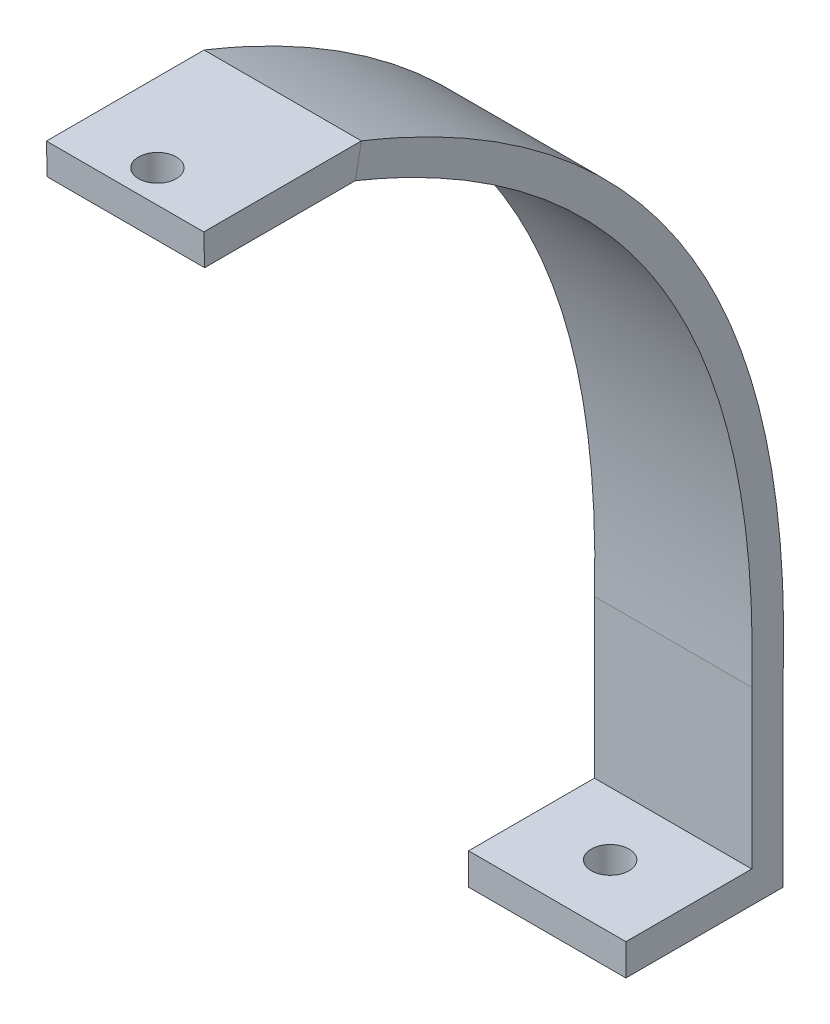
ISO-10303-21;
HEADER;
FILE_DESCRIPTION(('STEP AP214'),'2;1');
FILE_NAME('part.step','',(''),(''),'','','');
FILE_SCHEMA(('AUTOMOTIVE_DESIGN { 1 0 10303 214 1 1 1 1 }'));
ENDSEC;
DATA;
#1=APPLICATION_CONTEXT('core data for automotive mechanical design processes');
#2=APPLICATION_PROTOCOL_DEFINITION('international standard','automotive_design',2000,#1);
#3=PRODUCT_CONTEXT('',#1,'mechanical');
#4=PRODUCT('Part','Part','',(#3));
#5=PRODUCT_RELATED_PRODUCT_CATEGORY('part','',(#4));
#6=PRODUCT_DEFINITION_FORMATION('','',#4);
#7=PRODUCT_DEFINITION_CONTEXT('part definition',#1,'design');
#8=PRODUCT_DEFINITION('design','',#6,#7);
#9=PRODUCT_DEFINITION_SHAPE('','',#8);
#10=(LENGTH_UNIT() NAMED_UNIT(*) SI_UNIT(.MILLI.,.METRE.));
#11=(NAMED_UNIT(*) PLANE_ANGLE_UNIT() SI_UNIT($,.RADIAN.));
#12=(NAMED_UNIT(*) SI_UNIT($,.STERADIAN.) SOLID_ANGLE_UNIT());
#13=UNCERTAINTY_MEASURE_WITH_UNIT(LENGTH_MEASURE(1.E-05),#10,'distance_accuracy_value','');
#14=(GEOMETRIC_REPRESENTATION_CONTEXT(3) GLOBAL_UNCERTAINTY_ASSIGNED_CONTEXT((#13)) GLOBAL_UNIT_ASSIGNED_CONTEXT((#10,
#11,#12)) REPRESENTATION_CONTEXT('',''));
#15=CARTESIAN_POINT('',(0.,0.,0.));
#16=DIRECTION('',(0.,0.,1.));
#17=DIRECTION('',(1.,0.,0.));
#18=AXIS2_PLACEMENT_3D('',#15,#16,#17);
#19=CARTESIAN_POINT('',(0.,2.,0.));
#20=DIRECTION('',(0.,1.,0.));
#21=DIRECTION('',(0.,0.,1.));
#22=AXIS2_PLACEMENT_3D('',#19,#20,#21);
#23=PLANE('',#22);
#24=CARTESIAN_POINT('',(0.,2.,1.));
#25=DIRECTION('',(0.,-1.,0.));
#26=DIRECTION('',(0.,0.,-1.));
#27=AXIS2_PLACEMENT_3D('',#24,#25,#26);
#28=CIRCLE('',#27,1.2);
#29=CARTESIAN_POINT('',(0.,2.,-0.199999999999999));
#30=VERTEX_POINT('',#29);
#31=EDGE_CURVE('E101',#30,#30,#28,.T.);
#32=ORIENTED_EDGE('',*,*,#31,.T.);
#33=EDGE_LOOP('',(#32));
#34=FACE_BOUND('',#33,.T.);
#35=DIRECTION('',(0.,0.,-1.));
#36=VECTOR('',#35,1.);
#37=CARTESIAN_POINT('',(5.,2.,-5.));
#38=LINE('',#37,#36);
#39=CARTESIAN_POINT('',(5.,2.,5.));
#40=VERTEX_POINT('',#39);
#41=CARTESIAN_POINT('',(5.,2.,-3.));
#42=VERTEX_POINT('',#41);
#43=EDGE_CURVE('E90',#40,#42,#38,.T.);
#44=ORIENTED_EDGE('',*,*,#43,.T.);
#45=DIRECTION('',(-1.,0.,0.));
#46=VECTOR('',#45,1.);
#47=CARTESIAN_POINT('',(5.,2.,-3.));
#48=LINE('',#47,#46);
#49=CARTESIAN_POINT('',(-5.,2.,-3.));
#50=VERTEX_POINT('',#49);
#51=EDGE_CURVE('E116',#42,#50,#48,.T.);
#52=ORIENTED_EDGE('',*,*,#51,.T.);
#53=DIRECTION('',(0.,0.,1.));
#54=VECTOR('',#53,1.);
#55=CARTESIAN_POINT('',(-5.,2.,-5.));
#56=LINE('',#55,#54);
#57=CARTESIAN_POINT('',(-5.,2.,5.));
#58=VERTEX_POINT('',#57);
#59=EDGE_CURVE('E387',#50,#58,#56,.T.);
#60=ORIENTED_EDGE('',*,*,#59,.T.);
#61=DIRECTION('',(1.,0.,0.));
#62=VECTOR('',#61,1.);
#63=CARTESIAN_POINT('',(-5.,2.,5.));
#64=LINE('',#63,#62);
#65=EDGE_CURVE('E61',#58,#40,#64,.T.);
#66=ORIENTED_EDGE('',*,*,#65,.T.);
#67=EDGE_LOOP('',(#44,#52,#60,#66));
#68=FACE_BOUND('',#67,.T.);
#69=ADVANCED_FACE('F32',(#34,#68),#23,.T.);
#70=CARTESIAN_POINT('',(5.,2.,-5.));
#71=DIRECTION('',(-1.,0.,0.));
#72=DIRECTION('',(0.,0.,1.));
#73=AXIS2_PLACEMENT_3D('',#70,#71,#72);
#74=PLANE('',#73);
#75=DIRECTION('',(0.,0.,-1.));
#76=VECTOR('',#75,1.);
#77=CARTESIAN_POINT('',(5.,0.,-5.));
#78=LINE('',#77,#76);
#79=CARTESIAN_POINT('',(5.,0.,5.));
#80=VERTEX_POINT('',#79);
#81=CARTESIAN_POINT('',(5.,0.,-5.));
#82=VERTEX_POINT('',#81);
#83=EDGE_CURVE('E96',#80,#82,#78,.T.);
#84=ORIENTED_EDGE('',*,*,#83,.T.);
#85=DIRECTION('',(0.,-1.,0.));
#86=VECTOR('',#85,1.);
#87=CARTESIAN_POINT('',(5.,2.,-5.));
#88=LINE('',#87,#86);
#89=CARTESIAN_POINT('',(5.,12.,-5.));
#90=VERTEX_POINT('',#89);
#91=EDGE_CURVE('E11',#90,#82,#88,.T.);
#92=ORIENTED_EDGE('',*,*,#91,.F.);
#93=CARTESIAN_POINT('',(5.,12.,-5.));
#94=CARTESIAN_POINT('',(5.,22.3632658361113,-5.28046975186084));
#95=CARTESIAN_POINT('',(5.,31.1513910853338,-3.21501063946566));
#96=CARTESIAN_POINT('',(5.,41.809722130131,3.47746034833373));
#97=CARTESIAN_POINT('',(5.,44.9382711035382,6.30406668486998));
#98=CARTESIAN_POINT('',(5.,48.9783334177636,11.4133242615931));
#99=CARTESIAN_POINT('',(5.,50.2165691056777,13.2611475640163));
#100=CARTESIAN_POINT('',(5.,52.4769849885105,17.2426759912301));
#101=CARTESIAN_POINT('',(5.,53.5064059590904,19.3957991207498));
#102=CARTESIAN_POINT('',(5.,54.4499525565197,21.7402650966684));
#103=CARTESIAN_POINT('',(5.,54.4846721577558,21.8264187287433));
#104=CARTESIAN_POINT('',(5.,54.5201279268258,21.9144587231581));
#105=B_SPLINE_CURVE_WITH_KNOTS('',3,(#93,#94,#95,#96,#97,#98,#99,#100,#101,#102,#103,#104),
.UNSPECIFIED.,.F.,.F.,(4,2,2,2,2,4),(0.,0.5,0.75,0.875,1.,1.00488840780157),.UNSPECIFIED.);
#106=CARTESIAN_POINT('',(5.,54.4144417620943,21.6520300804701));
#107=VERTEX_POINT('',#106);
#108=EDGE_CURVE('E121',#90,#107,#105,.T.);
#109=ORIENTED_EDGE('',*,*,#108,.T.);
#110=DIRECTION('',(0.,0.373567471586794,0.927603010006032));
#111=VECTOR('',#110,1.);
#112=CARTESIAN_POINT('',(5.,54.4144417620917,21.6520300804636));
#113=LINE('',#112,#111);
#114=CARTESIAN_POINT('',(5.,54.4765620077367,21.8062903078284));
#115=VERTEX_POINT('',#114);
#116=EDGE_CURVE('E163',#107,#115,#113,.T.);
#117=ORIENTED_EDGE('',*,*,#116,.T.);
#118=DIRECTION('',(0.,-0.981657731889877,0.190651770043768));
#119=VECTOR('',#118,1.);
#120=CARTESIAN_POINT('',(5.,54.4765624447987,21.8062902972207));
#121=LINE('',#120,#119);
#122=CARTESIAN_POINT('',(5.,52.4773292144307,22.1945697837879));
#123=VERTEX_POINT('',#122);
#124=EDGE_CURVE('E345',#115,#123,#121,.T.);
#125=ORIENTED_EDGE('',*,*,#124,.T.);
#126=CARTESIAN_POINT('',(5.,12.,-3.));
#127=CARTESIAN_POINT('',(5.,22.0814373185806,-3.2808248459327));
#128=CARTESIAN_POINT('',(5.,30.4284916155017,-1.29359038979988));
#129=CARTESIAN_POINT('',(5.,43.8686742646236,7.11644829314434));
#130=CARTESIAN_POINT('',(5.,48.9938122482758,13.5499038903159));
#131=CARTESIAN_POINT('',(5.,52.5394303646887,22.3479699195364));
#132=B_SPLINE_CURVE_WITH_KNOTS('',3,(#126,#127,#128,#129,#130,#131),.UNSPECIFIED.,.F.,.F.,(4,2,
4),(0.,0.5,1.),.UNSPECIFIED.);
#133=CARTESIAN_POINT('',(5.,12.,-3.));
#134=VERTEX_POINT('',#133);
#135=EDGE_CURVE('E126',#134,#123,#132,.T.);
#136=ORIENTED_EDGE('',*,*,#135,.F.);
#137=DIRECTION('',(0.,-1.,0.));
#138=VECTOR('',#137,1.);
#139=CARTESIAN_POINT('',(5.,12.,-3.));
#140=LINE('',#139,#138);
#141=EDGE_CURVE('E127',#134,#42,#140,.T.);
#142=ORIENTED_EDGE('',*,*,#141,.T.);
#143=ORIENTED_EDGE('',*,*,#43,.F.);
#144=DIRECTION('',(0.,-1.,0.));
#145=VECTOR('',#144,1.);
#146=CARTESIAN_POINT('',(5.,2.,5.));
#147=LINE('',#146,#145);
#148=EDGE_CURVE('E83',#40,#80,#147,.T.);
#149=ORIENTED_EDGE('',*,*,#148,.T.);
#150=EDGE_LOOP('',(#84,#92,#109,#117,#125,#136,#142,#143,#149));
#151=FACE_BOUND('',#150,.T.);
#152=ADVANCED_FACE('F34',(#151),#74,.F.);
#153=CARTESIAN_POINT('',(-5.,2.,-5.));
#154=DIRECTION('',(0.,0.,1.));
#155=DIRECTION('',(1.,0.,0.));
#156=AXIS2_PLACEMENT_3D('',#153,#154,#155);
#157=PLANE('',#156);
#158=DIRECTION('',(-1.,0.,0.));
#159=VECTOR('',#158,1.);
#160=CARTESIAN_POINT('',(-5.,0.,-5.));
#161=LINE('',#160,#159);
#162=CARTESIAN_POINT('',(-5.,0.,-5.));
#163=VERTEX_POINT('',#162);
#164=EDGE_CURVE('E100',#82,#163,#161,.T.);
#165=ORIENTED_EDGE('',*,*,#164,.T.);
#166=DIRECTION('',(0.,-1.,0.));
#167=VECTOR('',#166,1.);
#168=CARTESIAN_POINT('',(-5.,2.,-5.));
#169=LINE('',#168,#167);
#170=CARTESIAN_POINT('',(-5.,12.,-5.));
#171=VERTEX_POINT('',#170);
#172=EDGE_CURVE('E44',#171,#163,#169,.T.);
#173=ORIENTED_EDGE('',*,*,#172,.F.);
#174=DIRECTION('',(-1.,0.,0.));
#175=VECTOR('',#174,1.);
#176=CARTESIAN_POINT('',(5.,12.,-5.));
#177=LINE('',#176,#175);
#178=EDGE_CURVE('E112',#90,#171,#177,.T.);
#179=ORIENTED_EDGE('',*,*,#178,.F.);
#180=ORIENTED_EDGE('',*,*,#91,.T.);
#181=EDGE_LOOP('',(#165,#173,#179,#180));
#182=FACE_BOUND('',#181,.T.);
#183=ADVANCED_FACE('F298',(#182),#157,.F.);
#184=CARTESIAN_POINT('',(-5.,2.,-5.));
#185=DIRECTION('',(1.,0.,0.));
#186=DIRECTION('',(0.,0.,-1.));
#187=AXIS2_PLACEMENT_3D('',#184,#185,#186);
#188=PLANE('',#187);
#189=DIRECTION('',(0.,0.,1.));
#190=VECTOR('',#189,1.);
#191=CARTESIAN_POINT('',(-5.,0.,-5.));
#192=LINE('',#191,#190);
#193=CARTESIAN_POINT('',(-5.,0.,5.));
#194=VERTEX_POINT('',#193);
#195=EDGE_CURVE('E91',#163,#194,#192,.T.);
#196=ORIENTED_EDGE('',*,*,#195,.T.);
#197=DIRECTION('',(0.,-1.,0.));
#198=VECTOR('',#197,1.);
#199=CARTESIAN_POINT('',(-5.,2.,5.));
#200=LINE('',#199,#198);
#201=EDGE_CURVE('E86',#58,#194,#200,.T.);
#202=ORIENTED_EDGE('',*,*,#201,.F.);
#203=ORIENTED_EDGE('',*,*,#59,.F.);
#204=DIRECTION('',(0.,-1.,0.));
#205=VECTOR('',#204,1.);
#206=CARTESIAN_POINT('',(-5.,12.,-3.));
#207=LINE('',#206,#205);
#208=CARTESIAN_POINT('',(-5.,12.,-3.));
#209=VERTEX_POINT('',#208);
#210=EDGE_CURVE('E52',#209,#50,#207,.T.);
#211=ORIENTED_EDGE('',*,*,#210,.F.);
#212=CARTESIAN_POINT('',(-5.,12.,-3.));
#213=CARTESIAN_POINT('',(-5.,22.0814373185806,-3.2808248459327));
#214=CARTESIAN_POINT('',(-5.,30.4284916155017,-1.29359038979988));
#215=CARTESIAN_POINT('',(-5.,43.8686742646236,7.11644829314434));
#216=CARTESIAN_POINT('',(-5.,48.9938122482758,13.5499038903159));
#217=CARTESIAN_POINT('',(-5.,52.5394303646887,22.3479699195364));
#218=B_SPLINE_CURVE_WITH_KNOTS('',3,(#212,#213,#214,#215,#216,#217),.UNSPECIFIED.,.F.,.F.,(4,2,
4),(0.,0.5,1.),.UNSPECIFIED.);
#219=CARTESIAN_POINT('',(-5.,52.4773292183178,22.1945697824155));
#220=VERTEX_POINT('',#219);
#221=EDGE_CURVE('E160',#209,#220,#218,.T.);
#222=ORIENTED_EDGE('',*,*,#221,.T.);
#223=DIRECTION('',(0.,-0.981657732027772,0.190651769333753));
#224=VECTOR('',#223,1.);
#225=CARTESIAN_POINT('',(-5.,54.4765624447987,21.8062902972207));
#226=LINE('',#225,#224);
#227=CARTESIAN_POINT('',(-5.,54.4765620077367,21.8062903078285));
#228=VERTEX_POINT('',#227);
#229=EDGE_CURVE('E236',#228,#220,#226,.T.);
#230=ORIENTED_EDGE('',*,*,#229,.F.);
#231=DIRECTION('',(0.,0.373567471586794,0.927603010006032));
#232=VECTOR('',#231,1.);
#233=CARTESIAN_POINT('',(-5.,54.4144417620917,21.6520300804636));
#234=LINE('',#233,#232);
#235=CARTESIAN_POINT('',(-5.,54.4144417620943,21.6520300804701));
#236=VERTEX_POINT('',#235);
#237=EDGE_CURVE('E145',#236,#228,#234,.T.);
#238=ORIENTED_EDGE('',*,*,#237,.F.);
#239=CARTESIAN_POINT('',(-5.,12.,-5.));
#240=CARTESIAN_POINT('',(-5.,22.3632658361113,-5.28046975186084));
#241=CARTESIAN_POINT('',(-5.,31.1513910853338,-3.21501063946566));
#242=CARTESIAN_POINT('',(-5.,41.809722130131,3.47746034833373));
#243=CARTESIAN_POINT('',(-5.,44.9382711035382,6.30406668486998));
#244=CARTESIAN_POINT('',(-5.,48.9783334177636,11.4133242615931));
#245=CARTESIAN_POINT('',(-5.,50.2165691056777,13.2611475640163));
#246=CARTESIAN_POINT('',(-5.,52.4769849885105,17.2426759912301));
#247=CARTESIAN_POINT('',(-5.,53.5064059590904,19.3957991207498));
#248=CARTESIAN_POINT('',(-5.,54.4499525565197,21.7402650966684));
#249=CARTESIAN_POINT('',(-5.,54.4846721577558,21.8264187287433));
#250=CARTESIAN_POINT('',(-5.,54.5201279268258,21.9144587231581));
#251=B_SPLINE_CURVE_WITH_KNOTS('',3,(#239,#240,#241,#242,#243,#244,#245,#246,#247,#248,#249,
#250),.UNSPECIFIED.,.F.,.F.,(4,2,2,2,2,4),(0.,0.5,0.75,0.875,1.,1.00488840780157),.UNSPECIFIED.);
#252=EDGE_CURVE('E125',#171,#236,#251,.T.);
#253=ORIENTED_EDGE('',*,*,#252,.F.);
#254=ORIENTED_EDGE('',*,*,#172,.T.);
#255=EDGE_LOOP('',(#196,#202,#203,#211,#222,#230,#238,#253,#254));
#256=FACE_BOUND('',#255,.T.);
#257=ADVANCED_FACE('F295',(#256),#188,.F.);
#258=CARTESIAN_POINT('',(-5.,2.,5.));
#259=DIRECTION('',(0.,0.,-1.));
#260=DIRECTION('',(-1.,0.,0.));
#261=AXIS2_PLACEMENT_3D('',#258,#259,#260);
#262=PLANE('',#261);
#263=DIRECTION('',(1.,0.,0.));
#264=VECTOR('',#263,1.);
#265=CARTESIAN_POINT('',(-5.,0.,5.));
#266=LINE('',#265,#264);
#267=EDGE_CURVE('E80',#194,#80,#266,.T.);
#268=ORIENTED_EDGE('',*,*,#267,.T.);
#269=ORIENTED_EDGE('',*,*,#148,.F.);
#270=ORIENTED_EDGE('',*,*,#65,.F.);
#271=ORIENTED_EDGE('',*,*,#201,.T.);
#272=EDGE_LOOP('',(#268,#269,#270,#271));
#273=FACE_BOUND('',#272,.T.);
#274=ADVANCED_FACE('F82',(#273),#262,.F.);
#275=CARTESIAN_POINT('',(0.,0.,0.));
#276=DIRECTION('',(0.,1.,0.));
#277=DIRECTION('',(0.,0.,1.));
#278=AXIS2_PLACEMENT_3D('',#275,#276,#277);
#279=PLANE('',#278);
#280=CARTESIAN_POINT('',(0.,0.,1.));
#281=DIRECTION('',(0.,-1.,0.));
#282=DIRECTION('',(0.,0.,-1.));
#283=AXIS2_PLACEMENT_3D('',#280,#281,#282);
#284=CIRCLE('',#283,1.2);
#285=CARTESIAN_POINT('',(0.,0.,-0.199999999999997));
#286=VERTEX_POINT('',#285);
#287=EDGE_CURVE('E105',#286,#286,#284,.T.);
#288=ORIENTED_EDGE('',*,*,#287,.F.);
#289=EDGE_LOOP('',(#288));
#290=FACE_BOUND('',#289,.T.);
#291=ORIENTED_EDGE('',*,*,#83,.F.);
#292=ORIENTED_EDGE('',*,*,#267,.F.);
#293=ORIENTED_EDGE('',*,*,#195,.F.);
#294=ORIENTED_EDGE('',*,*,#164,.F.);
#295=EDGE_LOOP('',(#291,#292,#293,#294));
#296=FACE_BOUND('',#295,.T.);
#297=ADVANCED_FACE('F99',(#290,#296),#279,.F.);
#298=CARTESIAN_POINT('',(0.,0.,1.));
#299=DIRECTION('',(0.,-1.,0.));
#300=DIRECTION('',(0.,0.,-1.));
#301=AXIS2_PLACEMENT_3D('',#298,#299,#300);
#302=CYLINDRICAL_SURFACE('',#301,1.2);
#303=ORIENTED_EDGE('',*,*,#31,.F.);
#304=EDGE_LOOP('',(#303));
#305=FACE_BOUND('',#304,.T.);
#306=ORIENTED_EDGE('',*,*,#287,.T.);
#307=EDGE_LOOP('',(#306));
#308=FACE_BOUND('',#307,.T.);
#309=ADVANCED_FACE('F284',(#305,#308),#302,.F.);
#310=CARTESIAN_POINT('',(5.,12.,-3.));
#311=DIRECTION('',(0.,0.,1.));
#312=DIRECTION('',(1.,0.,0.));
#313=AXIS2_PLACEMENT_3D('',#310,#311,#312);
#314=PLANE('',#313);
#315=ORIENTED_EDGE('',*,*,#51,.F.);
#316=ORIENTED_EDGE('',*,*,#141,.F.);
#317=DIRECTION('',(-1.,0.,0.));
#318=VECTOR('',#317,1.);
#319=CARTESIAN_POINT('',(5.,12.,-3.));
#320=LINE('',#319,#318);
#321=EDGE_CURVE('E115',#134,#209,#320,.T.);
#322=ORIENTED_EDGE('',*,*,#321,.T.);
#323=ORIENTED_EDGE('',*,*,#210,.T.);
#324=EDGE_LOOP('',(#315,#316,#322,#323));
#325=FACE_BOUND('',#324,.T.);
#326=ADVANCED_FACE('F279',(#325),#314,.T.);
#327=CARTESIAN_POINT('',(0.,49.478442659219,31.6902252451657));
#328=DIRECTION('',(0.,-0.0274436887085824,0.999623351042815));
#329=DIRECTION('',(0.,-0.999623351042815,-0.0274436887085823));
#330=AXIS2_PLACEMENT_3D('',#327,#328,#329);
#331=PLANE('',#330);
#332=DIRECTION('',(0.,-0.999623351042815,-0.0274436887085823));
#333=VECTOR('',#332,1.);
#334=CARTESIAN_POINT('',(-5.,52.4773127123474,31.7725563112914));
#335=LINE('',#334,#333);
#336=CARTESIAN_POINT('',(-5.,54.476559414433,31.8274436887086));
#337=VERTEX_POINT('',#336);
#338=CARTESIAN_POINT('',(-5.,52.4773127123474,31.7725563112914));
#339=VERTEX_POINT('',#338);
#340=EDGE_CURVE('E433',#337,#339,#335,.T.);
#341=ORIENTED_EDGE('',*,*,#340,.T.);
#342=DIRECTION('',(1.,0.,0.));
#343=VECTOR('',#342,1.);
#344=CARTESIAN_POINT('',(5.,52.4773127123474,31.7725563112914));
#345=LINE('',#344,#343);
#346=CARTESIAN_POINT('',(5.,52.4773127123474,31.7725563112914));
#347=VERTEX_POINT('',#346);
#348=EDGE_CURVE('E154',#339,#347,#345,.T.);
#349=ORIENTED_EDGE('',*,*,#348,.T.);
#350=DIRECTION('',(0.,0.999623351042815,0.0274436887085823));
#351=VECTOR('',#350,1.);
#352=CARTESIAN_POINT('',(5.,52.4773127123474,31.7725563112914));
#353=LINE('',#352,#351);
#354=CARTESIAN_POINT('',(5.,54.476559414433,31.8274436887086));
#355=VERTEX_POINT('',#354);
#356=EDGE_CURVE('E242',#347,#355,#353,.T.);
#357=ORIENTED_EDGE('',*,*,#356,.T.);
#358=DIRECTION('',(-1.,0.,0.));
#359=VECTOR('',#358,1.);
#360=CARTESIAN_POINT('',(5.,54.476559414433,31.8274436887086));
#361=LINE('',#360,#359);
#362=EDGE_CURVE('E246',#355,#337,#361,.T.);
#363=ORIENTED_EDGE('',*,*,#362,.T.);
#364=EDGE_LOOP('',(#341,#349,#357,#363));
#365=FACE_BOUND('',#364,.T.);
#366=ADVANCED_FACE('F214',(#365),#331,.T.);
#367=CARTESIAN_POINT('',(5.,52.4773127123474,21.6292696839158));
#368=DIRECTION('',(1.,0.,0.));
#369=DIRECTION('',(0.,1.,0.));
#370=AXIS2_PLACEMENT_3D('',#367,#368,#369);
#371=PLANE('',#370);
#372=ORIENTED_EDGE('',*,*,#124,.F.);
#373=DIRECTION('',(0.,0.,1.));
#374=VECTOR('',#373,1.);
#375=CARTESIAN_POINT('',(5.,54.476559414433,21.684157061333));
#376=LINE('',#375,#374);
#377=EDGE_CURVE('E225',#115,#355,#376,.T.);
#378=ORIENTED_EDGE('',*,*,#377,.T.);
#379=ORIENTED_EDGE('',*,*,#356,.F.);
#380=DIRECTION('',(0.,0.,1.));
#381=VECTOR('',#380,1.);
#382=CARTESIAN_POINT('',(5.,52.4773127123474,21.6292696839158));
#383=LINE('',#382,#381);
#384=EDGE_CURVE('E235',#123,#347,#383,.T.);
#385=ORIENTED_EDGE('',*,*,#384,.F.);
#386=EDGE_LOOP('',(#372,#378,#379,#385));
#387=FACE_BOUND('',#386,.T.);
#388=ADVANCED_FACE('F203',(#387),#371,.T.);
#389=CARTESIAN_POINT('',(5.,52.4773127123474,21.6292696839158));
#390=DIRECTION('',(0.,-1.,0.));
#391=DIRECTION('',(0.,0.,-1.));
#392=AXIS2_PLACEMENT_3D('',#389,#390,#391);
#393=PLANE('',#392);
#394=CARTESIAN_POINT('',(0.,52.4773127123474,29.7725563112914));
#395=DIRECTION('',(0.,-1.,0.));
#396=DIRECTION('',(0.,0.,-1.));
#397=AXIS2_PLACEMENT_3D('',#394,#395,#396);
#398=CIRCLE('',#397,1.19999999999999);
#399=CARTESIAN_POINT('',(0.,52.4773127123474,28.5725563112914));
#400=VERTEX_POINT('',#399);
#401=EDGE_CURVE('E447',#400,#400,#398,.T.);
#402=ORIENTED_EDGE('',*,*,#401,.F.);
#403=EDGE_LOOP('',(#402));
#404=FACE_BOUND('',#403,.T.);
#405=DIRECTION('',(0.,0.,1.));
#406=VECTOR('',#405,1.);
#407=CARTESIAN_POINT('',(-5.,52.4773127123474,21.6292696839158));
#408=LINE('',#407,#406);
#409=EDGE_CURVE('E253',#220,#339,#408,.T.);
#410=ORIENTED_EDGE('',*,*,#409,.F.);
#411=DIRECTION('',(1.,0.,0.));
#412=VECTOR('',#411,1.);
#413=CARTESIAN_POINT('',(0.,52.4773127123474,22.194576487717));
#414=LINE('',#413,#412);
#415=EDGE_CURVE('E371',#220,#123,#414,.T.);
#416=ORIENTED_EDGE('',*,*,#415,.T.);
#417=ORIENTED_EDGE('',*,*,#384,.T.);
#418=ORIENTED_EDGE('',*,*,#348,.F.);
#419=EDGE_LOOP('',(#410,#416,#417,#418));
#420=FACE_BOUND('',#419,.T.);
#421=ADVANCED_FACE('F213',(#404,#420),#393,.T.);
#422=CARTESIAN_POINT('',(5.,54.476559414433,21.684157061333));
#423=DIRECTION('',(0.,1.,0.));
#424=DIRECTION('',(0.,0.,1.));
#425=AXIS2_PLACEMENT_3D('',#422,#423,#424);
#426=PLANE('',#425);
#427=CARTESIAN_POINT('',(0.,54.476559414433,29.7725563112914));
#428=DIRECTION('',(0.,1.,0.));
#429=DIRECTION('',(0.,0.,1.));
#430=AXIS2_PLACEMENT_3D('',#427,#428,#429);
#431=CIRCLE('',#430,1.19999999999999);
#432=CARTESIAN_POINT('',(0.,54.476559414433,30.9725563112914));
#433=VERTEX_POINT('',#432);
#434=EDGE_CURVE('E252',#433,#433,#431,.T.);
#435=ORIENTED_EDGE('',*,*,#434,.F.);
#436=EDGE_LOOP('',(#435));
#437=FACE_BOUND('',#436,.T.);
#438=DIRECTION('',(-1.,0.,0.));
#439=VECTOR('',#438,1.);
#440=CARTESIAN_POINT('',(0.,54.476559414433,21.80629151762));
#441=LINE('',#440,#439);
#442=EDGE_CURVE('E369',#228,#115,#441,.F.);
#443=ORIENTED_EDGE('',*,*,#442,.F.);
#444=DIRECTION('',(0.,0.,1.));
#445=VECTOR('',#444,1.);
#446=CARTESIAN_POINT('',(-5.,54.476559414433,21.684157061333));
#447=LINE('',#446,#445);
#448=EDGE_CURVE('E234',#228,#337,#447,.T.);
#449=ORIENTED_EDGE('',*,*,#448,.T.);
#450=ORIENTED_EDGE('',*,*,#362,.F.);
#451=ORIENTED_EDGE('',*,*,#377,.F.);
#452=EDGE_LOOP('',(#443,#449,#450,#451));
#453=FACE_BOUND('',#452,.T.);
#454=ADVANCED_FACE('F216',(#437,#453),#426,.T.);
#455=CARTESIAN_POINT('',(-5.,52.4773127123474,21.6292696839158));
#456=DIRECTION('',(-1.,0.,0.));
#457=DIRECTION('',(0.,0.,1.));
#458=AXIS2_PLACEMENT_3D('',#455,#456,#457);
#459=PLANE('',#458);
#460=ORIENTED_EDGE('',*,*,#448,.F.);
#461=ORIENTED_EDGE('',*,*,#229,.T.);
#462=ORIENTED_EDGE('',*,*,#409,.T.);
#463=ORIENTED_EDGE('',*,*,#340,.F.);
#464=EDGE_LOOP('',(#460,#461,#462,#463));
#465=FACE_BOUND('',#464,.T.);
#466=ADVANCED_FACE('F198',(#465),#459,.T.);
#467=CARTESIAN_POINT('',(-5.,12.,-3.));
#468=CARTESIAN_POINT('',(-5.,22.0814373185806,-3.2808248459327));
#469=CARTESIAN_POINT('',(-5.,30.4284916155017,-1.29359038979988));
#470=CARTESIAN_POINT('',(-5.,43.8686742646236,7.11644829314434));
#471=CARTESIAN_POINT('',(-5.,48.9916837981885,13.5507599197534));
#472=CARTESIAN_POINT('',(-5.,52.5394303646887,22.3479699195364));
#473=CARTESIAN_POINT('',(5.,12.,-3.));
#474=CARTESIAN_POINT('',(5.,22.0814373185806,-3.2808248459327));
#475=CARTESIAN_POINT('',(5.,30.4284916155017,-1.29359038979988));
#476=CARTESIAN_POINT('',(5.,43.8686742646236,7.11644829314434));
#477=CARTESIAN_POINT('',(5.,48.9916837981885,13.5507599197534));
#478=CARTESIAN_POINT('',(5.,52.5394303646887,22.3479699195364));
#479=B_SPLINE_SURFACE_WITH_KNOTS('',1,3,((#467,#468,#469,#470,#471,#472),(#473,#474,#475,#476,
#477,#478)),.UNSPECIFIED.,.F.,.F.,.F.,(2,2),(4,2,4),(0.,1.),(0.,0.5,1.),.UNSPECIFIED.);
#480=ORIENTED_EDGE('',*,*,#415,.F.);
#481=ORIENTED_EDGE('',*,*,#221,.F.);
#482=ORIENTED_EDGE('',*,*,#321,.F.);
#483=ORIENTED_EDGE('',*,*,#135,.T.);
#484=EDGE_LOOP('',(#480,#481,#482,#483));
#485=FACE_BOUND('',#484,.T.);
#486=ADVANCED_FACE('F185',(#485),#479,.T.);
#487=CARTESIAN_POINT('',(5.,12.,-5.));
#488=CARTESIAN_POINT('',(5.,22.3632658361113,-5.28046975186084));
#489=CARTESIAN_POINT('',(5.,31.1513910853338,-3.21501063946566));
#490=CARTESIAN_POINT('',(5.,41.809722130131,3.47746034833373));
#491=CARTESIAN_POINT('',(5.,44.9382711035382,6.30406668486998));
#492=CARTESIAN_POINT('',(5.,48.9783334177636,11.4133242615931));
#493=CARTESIAN_POINT('',(5.,50.2165691056777,13.2611475640163));
#494=CARTESIAN_POINT('',(5.,52.4769849885105,17.2426759912301));
#495=CARTESIAN_POINT('',(5.,53.5064059590904,19.3957991207498));
#496=CARTESIAN_POINT('',(5.,54.4499525565197,21.7402650966684));
#497=CARTESIAN_POINT('',(5.,54.4846721577558,21.8264187287433));
#498=CARTESIAN_POINT('',(5.,54.5201279268258,21.9144587231581));
#499=CARTESIAN_POINT('',(-5.,12.,-5.));
#500=CARTESIAN_POINT('',(-5.,22.3632658361113,-5.28046975186084));
#501=CARTESIAN_POINT('',(-5.,31.1513910853338,-3.21501063946566));
#502=CARTESIAN_POINT('',(-5.,41.809722130131,3.47746034833373));
#503=CARTESIAN_POINT('',(-5.,44.9382711035382,6.30406668486998));
#504=CARTESIAN_POINT('',(-5.,48.9783334177636,11.4133242615931));
#505=CARTESIAN_POINT('',(-5.,50.2165691056777,13.2611475640163));
#506=CARTESIAN_POINT('',(-5.,52.4769849885105,17.2426759912301));
#507=CARTESIAN_POINT('',(-5.,53.5064059590904,19.3957991207498));
#508=CARTESIAN_POINT('',(-5.,54.4499525565197,21.7402650966684));
#509=CARTESIAN_POINT('',(-5.,54.4846721577558,21.8264187287433));
#510=CARTESIAN_POINT('',(-5.,54.5201279268258,21.9144587231581));
#511=B_SPLINE_SURFACE_WITH_KNOTS('',1,3,((#487,#488,#489,#490,#491,#492,#493,#494,#495,#496,
#497,#498),(#499,#500,#501,#502,#503,#504,#505,#506,#507,#508,#509,#510)),.UNSPECIFIED.,.F.,.F.,
.F.,(2,2),(4,2,2,2,2,4),(0.,1.),(0.,0.5,0.75,0.875,1.,1.00488840780157),.UNSPECIFIED.);
#512=ORIENTED_EDGE('',*,*,#237,.T.);
#513=ORIENTED_EDGE('',*,*,#442,.T.);
#514=ORIENTED_EDGE('',*,*,#116,.F.);
#515=ORIENTED_EDGE('',*,*,#108,.F.);
#516=ORIENTED_EDGE('',*,*,#178,.T.);
#517=ORIENTED_EDGE('',*,*,#252,.T.);
#518=EDGE_LOOP('',(#512,#513,#514,#515,#516,#517));
#519=FACE_BOUND('',#518,.T.);
#520=ADVANCED_FACE('F197',(#519),#511,.T.);
#521=CARTESIAN_POINT('',(0.,52.4773127123474,29.7725563112914));
#522=DIRECTION('',(0.,-1.,0.));
#523=DIRECTION('',(0.,0.,-1.));
#524=AXIS2_PLACEMENT_3D('',#521,#522,#523);
#525=CYLINDRICAL_SURFACE('',#524,1.19999999999999);
#526=ORIENTED_EDGE('',*,*,#434,.T.);
#527=EDGE_LOOP('',(#526));
#528=FACE_BOUND('',#527,.T.);
#529=ORIENTED_EDGE('',*,*,#401,.T.);
#530=EDGE_LOOP('',(#529));
#531=FACE_BOUND('',#530,.T.);
#532=ADVANCED_FACE('F281',(#528,#531),#525,.F.);
#533=CLOSED_SHELL('',(#69,#152,#183,#257,#274,#297,#309,#326,#366,#388,#421,#454,#466,#486,#520,#532));
#534=MANIFOLD_SOLID_BREP('B2',#533);
#535=ADVANCED_BREP_SHAPE_REPRESENTATION('',(#18,#534),#14);
#536=SHAPE_DEFINITION_REPRESENTATION(#9,#535);
ENDSEC;
END-ISO-10303-21;
